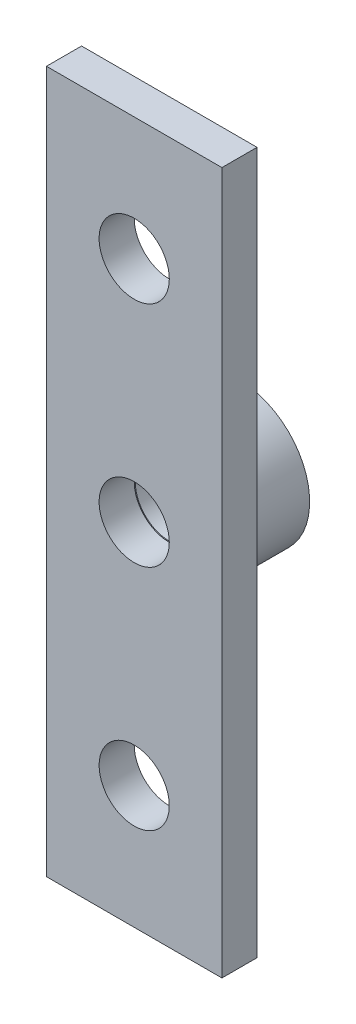
ISO-10303-21;
HEADER;
FILE_DESCRIPTION(('STEP AP214'),'2;1');
FILE_NAME('part.step','',(''),(''),'','','');
FILE_SCHEMA(('AUTOMOTIVE_DESIGN { 1 0 10303 214 1 1 1 1 }'));
ENDSEC;
DATA;
#1=APPLICATION_CONTEXT('core data for automotive mechanical design processes');
#2=APPLICATION_PROTOCOL_DEFINITION('international standard','automotive_design',2000,#1);
#3=PRODUCT_CONTEXT('',#1,'mechanical');
#4=PRODUCT('Part','Part','',(#3));
#5=PRODUCT_RELATED_PRODUCT_CATEGORY('part','',(#4));
#6=PRODUCT_DEFINITION_FORMATION('','',#4);
#7=PRODUCT_DEFINITION_CONTEXT('part definition',#1,'design');
#8=PRODUCT_DEFINITION('design','',#6,#7);
#9=PRODUCT_DEFINITION_SHAPE('','',#8);
#10=(LENGTH_UNIT() NAMED_UNIT(*) SI_UNIT(.MILLI.,.METRE.));
#11=(NAMED_UNIT(*) PLANE_ANGLE_UNIT() SI_UNIT($,.RADIAN.));
#12=(NAMED_UNIT(*) SI_UNIT($,.STERADIAN.) SOLID_ANGLE_UNIT());
#13=UNCERTAINTY_MEASURE_WITH_UNIT(LENGTH_MEASURE(1.E-05),#10,'distance_accuracy_value','');
#14=(GEOMETRIC_REPRESENTATION_CONTEXT(3) GLOBAL_UNCERTAINTY_ASSIGNED_CONTEXT((#13)) GLOBAL_UNIT_ASSIGNED_CONTEXT((#10,
#11,#12)) REPRESENTATION_CONTEXT('',''));
#15=CARTESIAN_POINT('',(0.,0.,0.));
#16=DIRECTION('',(0.,0.,1.));
#17=DIRECTION('',(1.,0.,0.));
#18=AXIS2_PLACEMENT_3D('',#15,#16,#17);
#19=CARTESIAN_POINT('',(0.,0.,2.));
#20=DIRECTION('',(0.,0.,-1.));
#21=DIRECTION('',(-1.,0.,0.));
#22=AXIS2_PLACEMENT_3D('',#19,#20,#21);
#23=PLANE('',#22);
#24=DIRECTION('',(0.,-1.,0.));
#25=VECTOR('',#24,1.);
#26=CARTESIAN_POINT('',(0.,0.,2.));
#27=LINE('',#26,#25);
#28=CARTESIAN_POINT('',(0.,40.,2.));
#29=VERTEX_POINT('',#28);
#30=CARTESIAN_POINT('',(0.,0.,2.));
#31=VERTEX_POINT('',#30);
#32=EDGE_CURVE('E84',#29,#31,#27,.T.);
#33=ORIENTED_EDGE('',*,*,#32,.T.);
#34=DIRECTION('',(1.,0.,0.));
#35=VECTOR('',#34,1.);
#36=CARTESIAN_POINT('',(0.,0.,2.));
#37=LINE('',#36,#35);
#38=CARTESIAN_POINT('',(10.,0.,2.));
#39=VERTEX_POINT('',#38);
#40=EDGE_CURVE('E79',#31,#39,#37,.T.);
#41=ORIENTED_EDGE('',*,*,#40,.T.);
#42=DIRECTION('',(0.,1.,0.));
#43=VECTOR('',#42,1.);
#44=CARTESIAN_POINT('',(10.,0.,2.));
#45=LINE('',#44,#43);
#46=CARTESIAN_POINT('',(10.,40.,2.));
#47=VERTEX_POINT('',#46);
#48=EDGE_CURVE('E82',#39,#47,#45,.T.);
#49=ORIENTED_EDGE('',*,*,#48,.T.);
#50=DIRECTION('',(-1.,0.,0.));
#51=VECTOR('',#50,1.);
#52=CARTESIAN_POINT('',(0.,40.,2.));
#53=LINE('',#52,#51);
#54=EDGE_CURVE('E49',#47,#29,#53,.T.);
#55=ORIENTED_EDGE('',*,*,#54,.T.);
#56=EDGE_LOOP('',(#33,#41,#49,#55));
#57=FACE_BOUND('',#56,.T.);
#58=CARTESIAN_POINT('',(5.,20.,2.));
#59=DIRECTION('',(0.,0.,1.));
#60=DIRECTION('',(1.,0.,0.));
#61=AXIS2_PLACEMENT_3D('',#58,#59,#60);
#62=CIRCLE('',#61,2.);
#63=CARTESIAN_POINT('',(7.,20.,2.));
#64=VERTEX_POINT('',#63);
#65=EDGE_CURVE('E99',#64,#64,#62,.T.);
#66=ORIENTED_EDGE('',*,*,#65,.F.);
#67=EDGE_LOOP('',(#66));
#68=FACE_BOUND('',#67,.T.);
#69=CARTESIAN_POINT('',(5.,33.,2.));
#70=DIRECTION('',(0.,0.,1.));
#71=DIRECTION('',(1.,0.,0.));
#72=AXIS2_PLACEMENT_3D('',#69,#70,#71);
#73=CIRCLE('',#72,2.);
#74=CARTESIAN_POINT('',(7.,33.,2.));
#75=VERTEX_POINT('',#74);
#76=EDGE_CURVE('E114',#75,#75,#73,.T.);
#77=ORIENTED_EDGE('',*,*,#76,.F.);
#78=EDGE_LOOP('',(#77));
#79=FACE_BOUND('',#78,.T.);
#80=CARTESIAN_POINT('',(5.,7.,2.));
#81=DIRECTION('',(0.,0.,1.));
#82=DIRECTION('',(-1.,0.,0.));
#83=AXIS2_PLACEMENT_3D('',#80,#81,#82);
#84=CIRCLE('',#83,2.);
#85=CARTESIAN_POINT('',(3.,7.,2.));
#86=VERTEX_POINT('',#85);
#87=EDGE_CURVE('E120',#86,#86,#84,.T.);
#88=ORIENTED_EDGE('',*,*,#87,.F.);
#89=EDGE_LOOP('',(#88));
#90=FACE_BOUND('',#89,.T.);
#91=ADVANCED_FACE('F32',(#57,#68,#79,#90),#23,.F.);
#92=CARTESIAN_POINT('',(0.,0.,0.));
#93=DIRECTION('',(0.,0.,-1.));
#94=DIRECTION('',(-1.,0.,0.));
#95=AXIS2_PLACEMENT_3D('',#92,#93,#94);
#96=PLANE('',#95);
#97=CARTESIAN_POINT('',(5.,20.,0.));
#98=DIRECTION('',(0.,0.,-1.));
#99=DIRECTION('',(-1.,0.,0.));
#100=AXIS2_PLACEMENT_3D('',#97,#98,#99);
#101=CIRCLE('',#100,4.);
#102=CARTESIAN_POINT('',(1.,20.,0.));
#103=VERTEX_POINT('',#102);
#104=EDGE_CURVE('E129',#103,#103,#101,.T.);
#105=ORIENTED_EDGE('',*,*,#104,.F.);
#106=EDGE_LOOP('',(#105));
#107=FACE_BOUND('',#106,.T.);
#108=CARTESIAN_POINT('',(5.,33.,0.));
#109=DIRECTION('',(0.,0.,1.));
#110=DIRECTION('',(1.,0.,0.));
#111=AXIS2_PLACEMENT_3D('',#108,#109,#110);
#112=CIRCLE('',#111,2.);
#113=CARTESIAN_POINT('',(7.,33.,0.));
#114=VERTEX_POINT('',#113);
#115=EDGE_CURVE('E117',#114,#114,#112,.T.);
#116=ORIENTED_EDGE('',*,*,#115,.T.);
#117=EDGE_LOOP('',(#116));
#118=FACE_BOUND('',#117,.T.);
#119=DIRECTION('',(0.,-1.,0.));
#120=VECTOR('',#119,1.);
#121=CARTESIAN_POINT('',(0.,0.,0.));
#122=LINE('',#121,#120);
#123=CARTESIAN_POINT('',(0.,40.,0.));
#124=VERTEX_POINT('',#123);
#125=CARTESIAN_POINT('',(0.,0.,0.));
#126=VERTEX_POINT('',#125);
#127=EDGE_CURVE('E96',#124,#126,#122,.T.);
#128=ORIENTED_EDGE('',*,*,#127,.F.);
#129=DIRECTION('',(-1.,0.,0.));
#130=VECTOR('',#129,1.);
#131=CARTESIAN_POINT('',(0.,40.,0.));
#132=LINE('',#131,#130);
#133=CARTESIAN_POINT('',(10.,40.,0.));
#134=VERTEX_POINT('',#133);
#135=EDGE_CURVE('E72',#134,#124,#132,.T.);
#136=ORIENTED_EDGE('',*,*,#135,.F.);
#137=DIRECTION('',(0.,1.,0.));
#138=VECTOR('',#137,1.);
#139=CARTESIAN_POINT('',(10.,0.,0.));
#140=LINE('',#139,#138);
#141=CARTESIAN_POINT('',(10.,0.,0.));
#142=VERTEX_POINT('',#141);
#143=EDGE_CURVE('E66',#142,#134,#140,.T.);
#144=ORIENTED_EDGE('',*,*,#143,.F.);
#145=DIRECTION('',(1.,0.,0.));
#146=VECTOR('',#145,1.);
#147=CARTESIAN_POINT('',(0.,0.,0.));
#148=LINE('',#147,#146);
#149=EDGE_CURVE('E88',#126,#142,#148,.T.);
#150=ORIENTED_EDGE('',*,*,#149,.F.);
#151=EDGE_LOOP('',(#128,#136,#144,#150));
#152=FACE_BOUND('',#151,.T.);
#153=CARTESIAN_POINT('',(5.,7.,0.));
#154=DIRECTION('',(0.,0.,1.));
#155=DIRECTION('',(-1.,0.,0.));
#156=AXIS2_PLACEMENT_3D('',#153,#154,#155);
#157=CIRCLE('',#156,2.);
#158=CARTESIAN_POINT('',(3.,7.,0.));
#159=VERTEX_POINT('',#158);
#160=EDGE_CURVE('E123',#159,#159,#157,.T.);
#161=ORIENTED_EDGE('',*,*,#160,.T.);
#162=EDGE_LOOP('',(#161));
#163=FACE_BOUND('',#162,.T.);
#164=ADVANCED_FACE('F107',(#107,#118,#152,#163),#96,.T.);
#165=CARTESIAN_POINT('',(0.,0.,2.));
#166=DIRECTION('',(1.,0.,0.));
#167=DIRECTION('',(0.,0.,-1.));
#168=AXIS2_PLACEMENT_3D('',#165,#166,#167);
#169=PLANE('',#168);
#170=ORIENTED_EDGE('',*,*,#127,.T.);
#171=DIRECTION('',(0.,0.,-1.));
#172=VECTOR('',#171,1.);
#173=CARTESIAN_POINT('',(0.,0.,2.));
#174=LINE('',#173,#172);
#175=EDGE_CURVE('E11',#31,#126,#174,.T.);
#176=ORIENTED_EDGE('',*,*,#175,.F.);
#177=ORIENTED_EDGE('',*,*,#32,.F.);
#178=DIRECTION('',(0.,0.,-1.));
#179=VECTOR('',#178,1.);
#180=CARTESIAN_POINT('',(0.,40.,2.));
#181=LINE('',#180,#179);
#182=EDGE_CURVE('E92',#29,#124,#181,.T.);
#183=ORIENTED_EDGE('',*,*,#182,.T.);
#184=EDGE_LOOP('',(#170,#176,#177,#183));
#185=FACE_BOUND('',#184,.T.);
#186=ADVANCED_FACE('F34',(#185),#169,.F.);
#187=CARTESIAN_POINT('',(0.,0.,2.));
#188=DIRECTION('',(0.,1.,0.));
#189=DIRECTION('',(0.,0.,1.));
#190=AXIS2_PLACEMENT_3D('',#187,#188,#189);
#191=PLANE('',#190);
#192=ORIENTED_EDGE('',*,*,#149,.T.);
#193=DIRECTION('',(0.,0.,-1.));
#194=VECTOR('',#193,1.);
#195=CARTESIAN_POINT('',(10.,0.,2.));
#196=LINE('',#195,#194);
#197=EDGE_CURVE('E41',#39,#142,#196,.T.);
#198=ORIENTED_EDGE('',*,*,#197,.F.);
#199=ORIENTED_EDGE('',*,*,#40,.F.);
#200=ORIENTED_EDGE('',*,*,#175,.T.);
#201=EDGE_LOOP('',(#192,#198,#199,#200));
#202=FACE_BOUND('',#201,.T.);
#203=ADVANCED_FACE('F87',(#202),#191,.F.);
#204=CARTESIAN_POINT('',(10.,0.,2.));
#205=DIRECTION('',(-1.,0.,0.));
#206=DIRECTION('',(0.,0.,1.));
#207=AXIS2_PLACEMENT_3D('',#204,#205,#206);
#208=PLANE('',#207);
#209=ORIENTED_EDGE('',*,*,#143,.T.);
#210=DIRECTION('',(0.,0.,-1.));
#211=VECTOR('',#210,1.);
#212=CARTESIAN_POINT('',(10.,40.,2.));
#213=LINE('',#212,#211);
#214=EDGE_CURVE('E89',#47,#134,#213,.T.);
#215=ORIENTED_EDGE('',*,*,#214,.F.);
#216=ORIENTED_EDGE('',*,*,#48,.F.);
#217=ORIENTED_EDGE('',*,*,#197,.T.);
#218=EDGE_LOOP('',(#209,#215,#216,#217));
#219=FACE_BOUND('',#218,.T.);
#220=ADVANCED_FACE('F90',(#219),#208,.F.);
#221=CARTESIAN_POINT('',(0.,40.,2.));
#222=DIRECTION('',(0.,-1.,0.));
#223=DIRECTION('',(0.,0.,-1.));
#224=AXIS2_PLACEMENT_3D('',#221,#222,#223);
#225=PLANE('',#224);
#226=ORIENTED_EDGE('',*,*,#135,.T.);
#227=ORIENTED_EDGE('',*,*,#182,.F.);
#228=ORIENTED_EDGE('',*,*,#54,.F.);
#229=ORIENTED_EDGE('',*,*,#214,.T.);
#230=EDGE_LOOP('',(#226,#227,#228,#229));
#231=FACE_BOUND('',#230,.T.);
#232=ADVANCED_FACE('F104',(#231),#225,.F.);
#233=CARTESIAN_POINT('',(5.,20.,2.));
#234=DIRECTION('',(0.,0.,-1.));
#235=DIRECTION('',(-1.,0.,0.));
#236=AXIS2_PLACEMENT_3D('',#233,#234,#235);
#237=CYLINDRICAL_SURFACE('',#236,2.);
#238=ORIENTED_EDGE('',*,*,#65,.T.);
#239=EDGE_LOOP('',(#238));
#240=FACE_BOUND('',#239,.T.);
#241=CARTESIAN_POINT('',(5.,20.,0.));
#242=DIRECTION('',(0.,0.,1.));
#243=DIRECTION('',(1.,0.,0.));
#244=AXIS2_PLACEMENT_3D('',#241,#242,#243);
#245=CIRCLE('',#244,2.);
#246=CARTESIAN_POINT('',(7.,20.,0.));
#247=VERTEX_POINT('',#246);
#248=EDGE_CURVE('E111',#247,#247,#245,.T.);
#249=ORIENTED_EDGE('',*,*,#248,.F.);
#250=EDGE_LOOP('',(#249));
#251=FACE_BOUND('',#250,.T.);
#252=ADVANCED_FACE('F168',(#240,#251),#237,.F.);
#253=CARTESIAN_POINT('',(5.,33.,2.));
#254=DIRECTION('',(0.,0.,-1.));
#255=DIRECTION('',(-1.,0.,0.));
#256=AXIS2_PLACEMENT_3D('',#253,#254,#255);
#257=CYLINDRICAL_SURFACE('',#256,2.);
#258=ORIENTED_EDGE('',*,*,#76,.T.);
#259=EDGE_LOOP('',(#258));
#260=FACE_BOUND('',#259,.T.);
#261=ORIENTED_EDGE('',*,*,#115,.F.);
#262=EDGE_LOOP('',(#261));
#263=FACE_BOUND('',#262,.T.);
#264=ADVANCED_FACE('F219',(#260,#263),#257,.F.);
#265=CARTESIAN_POINT('',(5.,7.,2.));
#266=DIRECTION('',(0.,0.,-1.));
#267=DIRECTION('',(-1.,0.,0.));
#268=AXIS2_PLACEMENT_3D('',#265,#266,#267);
#269=CYLINDRICAL_SURFACE('',#268,2.);
#270=ORIENTED_EDGE('',*,*,#87,.T.);
#271=EDGE_LOOP('',(#270));
#272=FACE_BOUND('',#271,.T.);
#273=ORIENTED_EDGE('',*,*,#160,.F.);
#274=EDGE_LOOP('',(#273));
#275=FACE_BOUND('',#274,.T.);
#276=ADVANCED_FACE('F156',(#272,#275),#269,.F.);
#277=CARTESIAN_POINT('',(5.,20.,0.));
#278=DIRECTION('',(0.,0.,-1.));
#279=DIRECTION('',(-1.,0.,0.));
#280=AXIS2_PLACEMENT_3D('',#277,#278,#279);
#281=PLANE('',#280);
#282=CARTESIAN_POINT('',(5.,20.,0.));
#283=DIRECTION('',(0.,0.,-1.));
#284=DIRECTION('',(-1.,0.,0.));
#285=AXIS2_PLACEMENT_3D('',#282,#283,#284);
#286=CIRCLE('',#285,1.93757162479453);
#287=CARTESIAN_POINT('',(3.06242837520547,20.,0.));
#288=VERTEX_POINT('',#287);
#289=EDGE_CURVE('E135',#288,#288,#286,.T.);
#290=ORIENTED_EDGE('',*,*,#289,.T.);
#291=EDGE_LOOP('',(#290));
#292=FACE_BOUND('',#291,.T.);
#293=ORIENTED_EDGE('',*,*,#248,.T.);
#294=EDGE_LOOP('',(#293));
#295=FACE_BOUND('',#294,.T.);
#296=ADVANCED_FACE('F147',(#292,#295),#281,.F.);
#297=CARTESIAN_POINT('',(5.,20.,-4.));
#298=DIRECTION('',(0.,0.,-1.));
#299=DIRECTION('',(-1.,0.,0.));
#300=AXIS2_PLACEMENT_3D('',#297,#298,#299);
#301=PLANE('',#300);
#302=CARTESIAN_POINT('',(5.,20.,-4.));
#303=DIRECTION('',(0.,0.,-1.));
#304=DIRECTION('',(-1.,0.,0.));
#305=AXIS2_PLACEMENT_3D('',#302,#303,#304);
#306=CIRCLE('',#305,4.);
#307=CARTESIAN_POINT('',(1.,20.,-4.));
#308=VERTEX_POINT('',#307);
#309=EDGE_CURVE('E126',#308,#308,#306,.T.);
#310=ORIENTED_EDGE('',*,*,#309,.T.);
#311=EDGE_LOOP('',(#310));
#312=FACE_BOUND('',#311,.T.);
#313=CARTESIAN_POINT('',(5.,20.,-4.));
#314=DIRECTION('',(0.,0.,-1.));
#315=DIRECTION('',(-1.,0.,0.));
#316=AXIS2_PLACEMENT_3D('',#313,#314,#315);
#317=CIRCLE('',#316,1.93757162479453);
#318=CARTESIAN_POINT('',(3.06242837520547,20.,-4.));
#319=VERTEX_POINT('',#318);
#320=EDGE_CURVE('E132',#319,#319,#317,.T.);
#321=ORIENTED_EDGE('',*,*,#320,.F.);
#322=EDGE_LOOP('',(#321));
#323=FACE_BOUND('',#322,.T.);
#324=ADVANCED_FACE('F144',(#312,#323),#301,.T.);
#325=CARTESIAN_POINT('',(5.,20.,-4.));
#326=DIRECTION('',(0.,0.,1.));
#327=DIRECTION('',(1.,0.,0.));
#328=AXIS2_PLACEMENT_3D('',#325,#326,#327);
#329=CYLINDRICAL_SURFACE('',#328,4.);
#330=ORIENTED_EDGE('',*,*,#309,.F.);
#331=EDGE_LOOP('',(#330));
#332=FACE_BOUND('',#331,.T.);
#333=ORIENTED_EDGE('',*,*,#104,.T.);
#334=EDGE_LOOP('',(#333));
#335=FACE_BOUND('',#334,.T.);
#336=ADVANCED_FACE('F146',(#332,#335),#329,.T.);
#337=CARTESIAN_POINT('',(5.,20.,-4.));
#338=DIRECTION('',(0.,0.,1.));
#339=DIRECTION('',(1.,0.,0.));
#340=AXIS2_PLACEMENT_3D('',#337,#338,#339);
#341=CYLINDRICAL_SURFACE('',#340,1.93757162479453);
#342=ORIENTED_EDGE('',*,*,#320,.T.);
#343=EDGE_LOOP('',(#342));
#344=FACE_BOUND('',#343,.T.);
#345=ORIENTED_EDGE('',*,*,#289,.F.);
#346=EDGE_LOOP('',(#345));
#347=FACE_BOUND('',#346,.T.);
#348=ADVANCED_FACE('F141',(#344,#347),#341,.F.);
#349=CLOSED_SHELL('',(#91,#164,#186,#203,#220,#232,#252,#264,#276,#296,#324,#336,#348));
#350=MANIFOLD_SOLID_BREP('B2',#349);
#351=ADVANCED_BREP_SHAPE_REPRESENTATION('',(#18,#350),#14);
#352=SHAPE_DEFINITION_REPRESENTATION(#9,#351);
ENDSEC;
END-ISO-10303-21;
